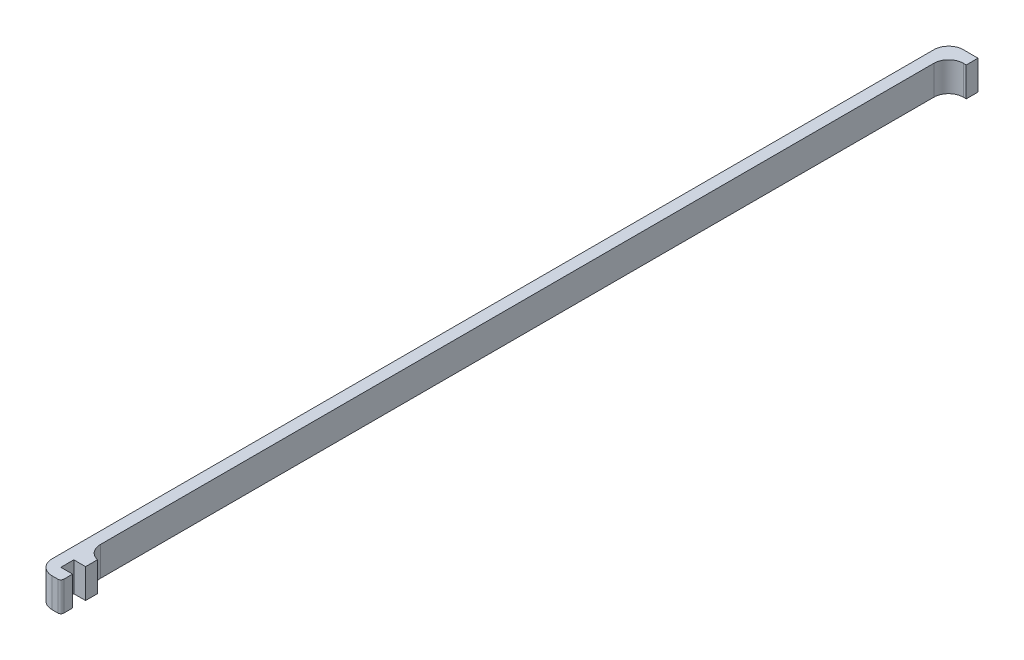
ISO-10303-21;
HEADER;
FILE_DESCRIPTION(('STEP AP214'),'2;1');
FILE_NAME('part.step','',(''),(''),'','','');
FILE_SCHEMA(('AUTOMOTIVE_DESIGN { 1 0 10303 214 1 1 1 1 }'));
ENDSEC;
DATA;
#1=APPLICATION_CONTEXT('core data for automotive mechanical design processes');
#2=APPLICATION_PROTOCOL_DEFINITION('international standard','automotive_design',2000,#1);
#3=PRODUCT_CONTEXT('',#1,'mechanical');
#4=PRODUCT('Part','Part','',(#3));
#5=PRODUCT_RELATED_PRODUCT_CATEGORY('part','',(#4));
#6=PRODUCT_DEFINITION_FORMATION('','',#4);
#7=PRODUCT_DEFINITION_CONTEXT('part definition',#1,'design');
#8=PRODUCT_DEFINITION('design','',#6,#7);
#9=PRODUCT_DEFINITION_SHAPE('','',#8);
#10=(LENGTH_UNIT() NAMED_UNIT(*) SI_UNIT(.MILLI.,.METRE.));
#11=(NAMED_UNIT(*) PLANE_ANGLE_UNIT() SI_UNIT($,.RADIAN.));
#12=(NAMED_UNIT(*) SI_UNIT($,.STERADIAN.) SOLID_ANGLE_UNIT());
#13=UNCERTAINTY_MEASURE_WITH_UNIT(LENGTH_MEASURE(1.E-05),#10,'distance_accuracy_value','');
#14=(GEOMETRIC_REPRESENTATION_CONTEXT(3) GLOBAL_UNCERTAINTY_ASSIGNED_CONTEXT((#13)) GLOBAL_UNIT_ASSIGNED_CONTEXT((#10,
#11,#12)) REPRESENTATION_CONTEXT('',''));
#15=CARTESIAN_POINT('',(0.,0.,0.));
#16=DIRECTION('',(0.,0.,1.));
#17=DIRECTION('',(1.,0.,0.));
#18=AXIS2_PLACEMENT_3D('',#15,#16,#17);
#19=CARTESIAN_POINT('',(-19.5,2.,-77.5));
#20=DIRECTION('',(0.,0.,1.));
#21=DIRECTION('',(1.,0.,0.));
#22=AXIS2_PLACEMENT_3D('',#19,#20,#21);
#23=PLANE('',#22);
#24=DIRECTION('',(0.,-1.,0.));
#25=VECTOR('',#24,1.);
#26=CARTESIAN_POINT('',(-14.5,2.,-77.5));
#27=LINE('',#26,#25);
#28=CARTESIAN_POINT('',(-14.5,30.,-77.5));
#29=VERTEX_POINT('',#28);
#30=CARTESIAN_POINT('',(-14.5,25.,-77.5));
#31=VERTEX_POINT('',#30);
#32=EDGE_CURVE('E267',#29,#31,#27,.T.);
#33=ORIENTED_EDGE('',*,*,#32,.T.);
#34=DIRECTION('',(-1.,0.,0.));
#35=VECTOR('',#34,1.);
#36=CARTESIAN_POINT('',(-14.5,25.,-77.5));
#37=LINE('',#36,#35);
#38=CARTESIAN_POINT('',(-17.,25.,-77.5));
#39=VERTEX_POINT('',#38);
#40=EDGE_CURVE('E98',#31,#39,#37,.T.);
#41=ORIENTED_EDGE('',*,*,#40,.T.);
#42=DIRECTION('',(0.,-1.,0.));
#43=VECTOR('',#42,1.);
#44=CARTESIAN_POINT('',(-17.,2.,-77.5));
#45=LINE('',#44,#43);
#46=CARTESIAN_POINT('',(-17.,30.,-77.5));
#47=VERTEX_POINT('',#46);
#48=EDGE_CURVE('E227',#39,#47,#45,.F.);
#49=ORIENTED_EDGE('',*,*,#48,.T.);
#50=DIRECTION('',(1.,0.,0.));
#51=VECTOR('',#50,1.);
#52=CARTESIAN_POINT('',(-19.5,30.,-77.5));
#53=LINE('',#52,#51);
#54=EDGE_CURVE('E253',#47,#29,#53,.T.);
#55=ORIENTED_EDGE('',*,*,#54,.T.);
#56=EDGE_LOOP('',(#33,#41,#49,#55));
#57=FACE_BOUND('',#56,.T.);
#58=ADVANCED_FACE('F83',(#57),#23,.F.);
#59=CARTESIAN_POINT('',(-17.5,42.8284271247462,75.5));
#60=DIRECTION('',(0.,0.,1.));
#61=DIRECTION('',(1.,0.,0.));
#62=AXIS2_PLACEMENT_3D('',#59,#60,#61);
#63=PLANE('',#62);
#64=DIRECTION('',(0.,-1.,0.));
#65=VECTOR('',#64,1.);
#66=CARTESIAN_POINT('',(-15.5,42.8284271247462,75.5));
#67=LINE('',#66,#65);
#68=CARTESIAN_POINT('',(-15.5,30.,75.5));
#69=VERTEX_POINT('',#68);
#70=CARTESIAN_POINT('',(-15.5,25.,75.5));
#71=VERTEX_POINT('',#70);
#72=EDGE_CURVE('E277',#69,#71,#67,.T.);
#73=ORIENTED_EDGE('',*,*,#72,.T.);
#74=DIRECTION('',(-1.,0.,0.));
#75=VECTOR('',#74,1.);
#76=CARTESIAN_POINT('',(-17.5,25.,75.5));
#77=LINE('',#76,#75);
#78=CARTESIAN_POINT('',(-17.5,25.,75.5));
#79=VERTEX_POINT('',#78);
#80=EDGE_CURVE('E325',#71,#79,#77,.T.);
#81=ORIENTED_EDGE('',*,*,#80,.T.);
#82=DIRECTION('',(0.,-1.,0.));
#83=VECTOR('',#82,1.);
#84=CARTESIAN_POINT('',(-17.5,42.8284271247462,75.5));
#85=LINE('',#84,#83);
#86=CARTESIAN_POINT('',(-17.5,30.,75.5));
#87=VERTEX_POINT('',#86);
#88=EDGE_CURVE('E276',#87,#79,#85,.T.);
#89=ORIENTED_EDGE('',*,*,#88,.F.);
#90=DIRECTION('',(1.,0.,0.));
#91=VECTOR('',#90,1.);
#92=CARTESIAN_POINT('',(-17.5,30.,75.5));
#93=LINE('',#92,#91);
#94=EDGE_CURVE('E261',#87,#69,#93,.T.);
#95=ORIENTED_EDGE('',*,*,#94,.T.);
#96=EDGE_LOOP('',(#73,#81,#89,#95));
#97=FACE_BOUND('',#96,.T.);
#98=ADVANCED_FACE('F318',(#97),#63,.F.);
#99=CARTESIAN_POINT('',(-19.5,2.,77.5));
#100=DIRECTION('',(0.,0.,-1.));
#101=DIRECTION('',(-1.,0.,0.));
#102=AXIS2_PLACEMENT_3D('',#99,#100,#101);
#103=PLANE('',#102);
#104=DIRECTION('',(0.,-1.,0.));
#105=VECTOR('',#104,1.);
#106=CARTESIAN_POINT('',(-17.,2.,77.5));
#107=LINE('',#106,#105);
#108=CARTESIAN_POINT('',(-17.,30.,77.5));
#109=VERTEX_POINT('',#108);
#110=CARTESIAN_POINT('',(-17.,25.,77.5));
#111=VERTEX_POINT('',#110);
#112=EDGE_CURVE('E280',#109,#111,#107,.T.);
#113=ORIENTED_EDGE('',*,*,#112,.T.);
#114=DIRECTION('',(-1.,0.,0.));
#115=VECTOR('',#114,1.);
#116=CARTESIAN_POINT('',(-14.5,25.,77.5));
#117=LINE('',#116,#115);
#118=CARTESIAN_POINT('',(-16.,25.,77.5));
#119=VERTEX_POINT('',#118);
#120=EDGE_CURVE('E202',#119,#111,#117,.T.);
#121=ORIENTED_EDGE('',*,*,#120,.F.);
#122=DIRECTION('',(0.,-1.,0.));
#123=VECTOR('',#122,1.);
#124=CARTESIAN_POINT('',(-16.,2.,77.5));
#125=LINE('',#124,#123);
#126=CARTESIAN_POINT('',(-16.,30.,77.5));
#127=VERTEX_POINT('',#126);
#128=EDGE_CURVE('E91',#119,#127,#125,.F.);
#129=ORIENTED_EDGE('',*,*,#128,.T.);
#130=DIRECTION('',(1.,0.,0.));
#131=VECTOR('',#130,1.);
#132=CARTESIAN_POINT('',(-19.5,30.,77.5));
#133=LINE('',#132,#131);
#134=EDGE_CURVE('E245',#109,#127,#133,.T.);
#135=ORIENTED_EDGE('',*,*,#134,.F.);
#136=EDGE_LOOP('',(#113,#121,#129,#135));
#137=FACE_BOUND('',#136,.T.);
#138=ADVANCED_FACE('F244',(#137),#103,.F.);
#139=CARTESIAN_POINT('',(-17.5,42.8284271247462,73.3));
#140=DIRECTION('',(0.,0.,-1.));
#141=DIRECTION('',(-1.,0.,0.));
#142=AXIS2_PLACEMENT_3D('',#139,#140,#141);
#143=PLANE('',#142);
#144=DIRECTION('',(0.,-1.,0.));
#145=VECTOR('',#144,1.);
#146=CARTESIAN_POINT('',(-17.5,42.8284271247462,73.3));
#147=LINE('',#146,#145);
#148=CARTESIAN_POINT('',(-17.5,30.,73.3));
#149=VERTEX_POINT('',#148);
#150=CARTESIAN_POINT('',(-17.5,25.,73.3));
#151=VERTEX_POINT('',#150);
#152=EDGE_CURVE('E270',#149,#151,#147,.T.);
#153=ORIENTED_EDGE('',*,*,#152,.T.);
#154=DIRECTION('',(1.,0.,0.));
#155=VECTOR('',#154,1.);
#156=CARTESIAN_POINT('',(-17.5,25.,73.3));
#157=LINE('',#156,#155);
#158=CARTESIAN_POINT('',(-15.5,25.,73.3));
#159=VERTEX_POINT('',#158);
#160=EDGE_CURVE('E334',#151,#159,#157,.T.);
#161=ORIENTED_EDGE('',*,*,#160,.T.);
#162=DIRECTION('',(0.,-1.,0.));
#163=VECTOR('',#162,1.);
#164=CARTESIAN_POINT('',(-15.5,42.8284271247462,73.3));
#165=LINE('',#164,#163);
#166=CARTESIAN_POINT('',(-15.5,30.,73.3));
#167=VERTEX_POINT('',#166);
#168=EDGE_CURVE('E273',#167,#159,#165,.T.);
#169=ORIENTED_EDGE('',*,*,#168,.F.);
#170=DIRECTION('',(-1.,0.,0.));
#171=VECTOR('',#170,1.);
#172=CARTESIAN_POINT('',(-17.5,30.,73.3));
#173=LINE('',#172,#171);
#174=EDGE_CURVE('E310',#167,#149,#173,.T.);
#175=ORIENTED_EDGE('',*,*,#174,.T.);
#176=EDGE_LOOP('',(#153,#161,#169,#175));
#177=FACE_BOUND('',#176,.T.);
#178=ADVANCED_FACE('F391',(#177),#143,.F.);
#179=CARTESIAN_POINT('',(0.,40.,-75.5));
#180=DIRECTION('',(0.,0.,-1.));
#181=DIRECTION('',(-1.,0.,0.));
#182=AXIS2_PLACEMENT_3D('',#179,#180,#181);
#183=PLANE('',#182);
#184=DIRECTION('',(0.,-1.,0.));
#185=VECTOR('',#184,1.);
#186=CARTESIAN_POINT('',(-15.,40.,-75.5));
#187=LINE('',#186,#185);
#188=CARTESIAN_POINT('',(-15.,30.,-75.5));
#189=VERTEX_POINT('',#188);
#190=CARTESIAN_POINT('',(-15.,25.,-75.5));
#191=VERTEX_POINT('',#190);
#192=EDGE_CURVE('E233',#189,#191,#187,.T.);
#193=ORIENTED_EDGE('',*,*,#192,.T.);
#194=DIRECTION('',(1.,0.,0.));
#195=VECTOR('',#194,1.);
#196=CARTESIAN_POINT('',(0.,25.,-75.5));
#197=LINE('',#196,#195);
#198=CARTESIAN_POINT('',(-14.5,25.,-75.5));
#199=VERTEX_POINT('',#198);
#200=EDGE_CURVE('E208',#191,#199,#197,.T.);
#201=ORIENTED_EDGE('',*,*,#200,.T.);
#202=DIRECTION('',(0.,1.,0.));
#203=VECTOR('',#202,1.);
#204=CARTESIAN_POINT('',(-14.5,40.,-75.5));
#205=LINE('',#204,#203);
#206=CARTESIAN_POINT('',(-14.5,30.,-75.5));
#207=VERTEX_POINT('',#206);
#208=EDGE_CURVE('E106',#199,#207,#205,.T.);
#209=ORIENTED_EDGE('',*,*,#208,.T.);
#210=DIRECTION('',(-1.,0.,0.));
#211=VECTOR('',#210,1.);
#212=CARTESIAN_POINT('',(0.,30.,-75.5));
#213=LINE('',#212,#211);
#214=EDGE_CURVE('E290',#207,#189,#213,.T.);
#215=ORIENTED_EDGE('',*,*,#214,.T.);
#216=EDGE_LOOP('',(#193,#201,#209,#215));
#217=FACE_BOUND('',#216,.T.);
#218=ADVANCED_FACE('F347',(#217),#183,.F.);
#219=CARTESIAN_POINT('',(-15.,40.,-73.));
#220=DIRECTION('',(0.,-1.,0.));
#221=DIRECTION('',(0.,0.,-1.));
#222=AXIS2_PLACEMENT_3D('',#219,#220,#221);
#223=CYLINDRICAL_SURFACE('',#222,2.5);
#224=DIRECTION('',(0.,-1.,0.));
#225=VECTOR('',#224,1.);
#226=CARTESIAN_POINT('',(-17.5,40.,-73.));
#227=LINE('',#226,#225);
#228=CARTESIAN_POINT('',(-17.5,25.,-73.));
#229=VERTEX_POINT('',#228);
#230=CARTESIAN_POINT('',(-17.5,30.,-73.));
#231=VERTEX_POINT('',#230);
#232=EDGE_CURVE('E223',#229,#231,#227,.F.);
#233=ORIENTED_EDGE('',*,*,#232,.F.);
#234=CARTESIAN_POINT('',(-15.,25.,-73.));
#235=DIRECTION('',(0.,1.,0.));
#236=DIRECTION('',(0.,0.,1.));
#237=AXIS2_PLACEMENT_3D('',#234,#235,#236);
#238=CIRCLE('',#237,2.5);
#239=EDGE_CURVE('E345',#229,#191,#238,.F.);
#240=ORIENTED_EDGE('',*,*,#239,.T.);
#241=ORIENTED_EDGE('',*,*,#192,.F.);
#242=CARTESIAN_POINT('',(-15.,30.,-73.));
#243=DIRECTION('',(0.,-1.,0.));
#244=DIRECTION('',(0.,0.,-1.));
#245=AXIS2_PLACEMENT_3D('',#242,#243,#244);
#246=CIRCLE('',#245,2.5);
#247=EDGE_CURVE('E298',#189,#231,#246,.F.);
#248=ORIENTED_EDGE('',*,*,#247,.T.);
#249=EDGE_LOOP('',(#233,#240,#241,#248));
#250=FACE_BOUND('',#249,.T.);
#251=ADVANCED_FACE('F379',(#250),#223,.F.);
#252=CARTESIAN_POINT('',(-17.5,40.,0.));
#253=DIRECTION('',(1.,0.,0.));
#254=DIRECTION('',(0.,0.,-1.));
#255=AXIS2_PLACEMENT_3D('',#252,#253,#254);
#256=PLANE('',#255);
#257=DIRECTION('',(0.,0.,1.));
#258=VECTOR('',#257,1.);
#259=CARTESIAN_POINT('',(-17.5,25.,0.));
#260=LINE('',#259,#258);
#261=EDGE_CURVE('E328',#151,#79,#260,.T.);
#262=ORIENTED_EDGE('',*,*,#261,.F.);
#263=ORIENTED_EDGE('',*,*,#152,.F.);
#264=DIRECTION('',(0.,0.,-1.));
#265=VECTOR('',#264,1.);
#266=CARTESIAN_POINT('',(-17.5,30.,0.));
#267=LINE('',#266,#265);
#268=EDGE_CURVE('E313',#87,#149,#267,.T.);
#269=ORIENTED_EDGE('',*,*,#268,.F.);
#270=ORIENTED_EDGE('',*,*,#88,.T.);
#271=EDGE_LOOP('',(#262,#263,#269,#270));
#272=FACE_BOUND('',#271,.T.);
#273=ADVANCED_FACE('F381',(#272),#256,.T.);
#274=CARTESIAN_POINT('',(-15.5,42.8284271247462,77.5));
#275=DIRECTION('',(-1.,0.,0.));
#276=DIRECTION('',(0.,0.,1.));
#277=AXIS2_PLACEMENT_3D('',#274,#275,#276);
#278=PLANE('',#277);
#279=ORIENTED_EDGE('',*,*,#168,.T.);
#280=DIRECTION('',(0.,0.,-1.));
#281=VECTOR('',#280,1.);
#282=CARTESIAN_POINT('',(-15.5,25.,77.5));
#283=LINE('',#282,#281);
#284=CARTESIAN_POINT('',(-15.5,25.,71.2494897427832));
#285=VERTEX_POINT('',#284);
#286=EDGE_CURVE('E337',#159,#285,#283,.T.);
#287=ORIENTED_EDGE('',*,*,#286,.T.);
#288=DIRECTION('',(0.,-1.,0.));
#289=VECTOR('',#288,1.);
#290=CARTESIAN_POINT('',(-15.5,4.,71.2494897427832));
#291=LINE('',#290,#289);
#292=CARTESIAN_POINT('',(-15.5,30.,71.2494897427832));
#293=VERTEX_POINT('',#292);
#294=EDGE_CURVE('E236',#285,#293,#291,.F.);
#295=ORIENTED_EDGE('',*,*,#294,.T.);
#296=DIRECTION('',(0.,0.,1.));
#297=VECTOR('',#296,1.);
#298=CARTESIAN_POINT('',(-15.5,30.,77.5));
#299=LINE('',#298,#297);
#300=EDGE_CURVE('E307',#293,#167,#299,.T.);
#301=ORIENTED_EDGE('',*,*,#300,.T.);
#302=EDGE_LOOP('',(#279,#287,#295,#301));
#303=FACE_BOUND('',#302,.T.);
#304=ADVANCED_FACE('F387',(#303),#278,.F.);
#305=DIRECTION('',(0.,-1.,0.));
#306=VECTOR('',#305,1.);
#307=CARTESIAN_POINT('',(-15.5,42.8284271247462,77.));
#308=LINE('',#307,#306);
#309=CARTESIAN_POINT('',(-15.5,30.,77.));
#310=VERTEX_POINT('',#309);
#311=CARTESIAN_POINT('',(-15.5,25.,77.));
#312=VERTEX_POINT('',#311);
#313=EDGE_CURVE('E238',#310,#312,#308,.T.);
#314=ORIENTED_EDGE('',*,*,#313,.T.);
#315=DIRECTION('',(0.,0.,-1.));
#316=VECTOR('',#315,1.);
#317=CARTESIAN_POINT('',(-15.5,25.,77.5));
#318=LINE('',#317,#316);
#319=EDGE_CURVE('E324',#312,#71,#318,.T.);
#320=ORIENTED_EDGE('',*,*,#319,.T.);
#321=ORIENTED_EDGE('',*,*,#72,.F.);
#322=DIRECTION('',(0.,0.,1.));
#323=VECTOR('',#322,1.);
#324=CARTESIAN_POINT('',(-15.5,30.,77.5));
#325=LINE('',#324,#323);
#326=EDGE_CURVE('E257',#69,#310,#325,.T.);
#327=ORIENTED_EDGE('',*,*,#326,.T.);
#328=EDGE_LOOP('',(#314,#320,#321,#327));
#329=FACE_BOUND('',#328,.T.);
#330=ADVANCED_FACE('F323',(#329),#278,.F.);
#331=DIRECTION('',(0.,0.,1.));
#332=VECTOR('',#331,1.);
#333=CARTESIAN_POINT('',(-17.5,25.,0.));
#334=LINE('',#333,#332);
#335=CARTESIAN_POINT('',(-17.5,25.,68.8));
#336=VERTEX_POINT('',#335);
#337=EDGE_CURVE('E343',#229,#336,#334,.T.);
#338=ORIENTED_EDGE('',*,*,#337,.F.);
#339=ORIENTED_EDGE('',*,*,#232,.T.);
#340=DIRECTION('',(0.,0.,-1.));
#341=VECTOR('',#340,1.);
#342=CARTESIAN_POINT('',(-17.5,30.,0.));
#343=LINE('',#342,#341);
#344=CARTESIAN_POINT('',(-17.5,30.,68.8));
#345=VERTEX_POINT('',#344);
#346=EDGE_CURVE('E301',#345,#231,#343,.T.);
#347=ORIENTED_EDGE('',*,*,#346,.F.);
#348=DIRECTION('',(0.,-1.,0.));
#349=VECTOR('',#348,1.);
#350=CARTESIAN_POINT('',(-17.5,40.,68.8));
#351=LINE('',#350,#349);
#352=EDGE_CURVE('E225',#345,#336,#351,.T.);
#353=ORIENTED_EDGE('',*,*,#352,.T.);
#354=EDGE_LOOP('',(#338,#339,#347,#353));
#355=FACE_BOUND('',#354,.T.);
#356=ADVANCED_FACE('F390',(#355),#256,.T.);
#357=CARTESIAN_POINT('',(-19.5,2.,-77.5));
#358=DIRECTION('',(1.,0.,0.));
#359=DIRECTION('',(0.,0.,-1.));
#360=AXIS2_PLACEMENT_3D('',#357,#358,#359);
#361=PLANE('',#360);
#362=DIRECTION('',(0.,-1.,0.));
#363=VECTOR('',#362,1.);
#364=CARTESIAN_POINT('',(-19.5,2.,-75.));
#365=LINE('',#364,#363);
#366=CARTESIAN_POINT('',(-19.5,30.,-75.));
#367=VERTEX_POINT('',#366);
#368=CARTESIAN_POINT('',(-19.5,25.,-75.));
#369=VERTEX_POINT('',#368);
#370=EDGE_CURVE('E217',#367,#369,#365,.T.);
#371=ORIENTED_EDGE('',*,*,#370,.T.);
#372=DIRECTION('',(0.,0.,-1.));
#373=VECTOR('',#372,1.);
#374=CARTESIAN_POINT('',(-19.5,25.,-77.5));
#375=LINE('',#374,#373);
#376=CARTESIAN_POINT('',(-19.5,25.,75.));
#377=VERTEX_POINT('',#376);
#378=EDGE_CURVE('E199',#377,#369,#375,.T.);
#379=ORIENTED_EDGE('',*,*,#378,.F.);
#380=DIRECTION('',(0.,-1.,0.));
#381=VECTOR('',#380,1.);
#382=CARTESIAN_POINT('',(-19.5,2.,75.));
#383=LINE('',#382,#381);
#384=CARTESIAN_POINT('',(-19.5,30.,75.));
#385=VERTEX_POINT('',#384);
#386=EDGE_CURVE('E214',#377,#385,#383,.F.);
#387=ORIENTED_EDGE('',*,*,#386,.T.);
#388=DIRECTION('',(0.,0.,-1.));
#389=VECTOR('',#388,1.);
#390=CARTESIAN_POINT('',(-19.5,30.,0.));
#391=LINE('',#390,#389);
#392=EDGE_CURVE('E254',#385,#367,#391,.T.);
#393=ORIENTED_EDGE('',*,*,#392,.T.);
#394=EDGE_LOOP('',(#371,#379,#387,#393));
#395=FACE_BOUND('',#394,.T.);
#396=ADVANCED_FACE('F212',(#395),#361,.F.);
#397=CARTESIAN_POINT('',(-17.,2.,-75.));
#398=DIRECTION('',(0.,-1.,0.));
#399=DIRECTION('',(0.,0.,-1.));
#400=AXIS2_PLACEMENT_3D('',#397,#398,#399);
#401=CYLINDRICAL_SURFACE('',#400,2.5);
#402=CARTESIAN_POINT('',(-17.,25.,-75.));
#403=DIRECTION('',(0.,1.,0.));
#404=DIRECTION('',(0.,0.,1.));
#405=AXIS2_PLACEMENT_3D('',#402,#403,#404);
#406=CIRCLE('',#405,2.5);
#407=EDGE_CURVE('E207',#369,#39,#406,.F.);
#408=ORIENTED_EDGE('',*,*,#407,.F.);
#409=ORIENTED_EDGE('',*,*,#370,.F.);
#410=CARTESIAN_POINT('',(-17.,30.,-75.));
#411=DIRECTION('',(0.,-1.,0.));
#412=DIRECTION('',(0.,0.,-1.));
#413=AXIS2_PLACEMENT_3D('',#410,#411,#412);
#414=CIRCLE('',#413,2.5);
#415=EDGE_CURVE('E259',#47,#367,#414,.F.);
#416=ORIENTED_EDGE('',*,*,#415,.F.);
#417=ORIENTED_EDGE('',*,*,#48,.F.);
#418=EDGE_LOOP('',(#408,#409,#416,#417));
#419=FACE_BOUND('',#418,.T.);
#420=ADVANCED_FACE('F292',(#419),#401,.T.);
#421=CARTESIAN_POINT('',(-17.,2.,75.));
#422=DIRECTION('',(0.,-1.,0.));
#423=DIRECTION('',(0.,0.,-1.));
#424=AXIS2_PLACEMENT_3D('',#421,#422,#423);
#425=CYLINDRICAL_SURFACE('',#424,2.5);
#426=CARTESIAN_POINT('',(-17.,25.,75.));
#427=DIRECTION('',(0.,1.,0.));
#428=DIRECTION('',(0.,0.,1.));
#429=AXIS2_PLACEMENT_3D('',#426,#427,#428);
#430=CIRCLE('',#429,2.5);
#431=EDGE_CURVE('E196',#111,#377,#430,.F.);
#432=ORIENTED_EDGE('',*,*,#431,.F.);
#433=ORIENTED_EDGE('',*,*,#112,.F.);
#434=CARTESIAN_POINT('',(-17.,30.,75.));
#435=DIRECTION('',(0.,-1.,0.));
#436=DIRECTION('',(0.,0.,-1.));
#437=AXIS2_PLACEMENT_3D('',#434,#435,#436);
#438=CIRCLE('',#437,2.5);
#439=EDGE_CURVE('E222',#385,#109,#438,.F.);
#440=ORIENTED_EDGE('',*,*,#439,.F.);
#441=ORIENTED_EDGE('',*,*,#386,.F.);
#442=EDGE_LOOP('',(#432,#433,#440,#441));
#443=FACE_BOUND('',#442,.T.);
#444=ADVANCED_FACE('F221',(#443),#425,.T.);
#445=CARTESIAN_POINT('',(-15.,40.,68.8));
#446=DIRECTION('',(0.,-1.,0.));
#447=DIRECTION('',(0.,0.,-1.));
#448=AXIS2_PLACEMENT_3D('',#445,#446,#447);
#449=CYLINDRICAL_SURFACE('',#448,2.5);
#450=ORIENTED_EDGE('',*,*,#294,.F.);
#451=CARTESIAN_POINT('',(-15.,25.,68.8));
#452=DIRECTION('',(0.,1.,0.));
#453=DIRECTION('',(0.,0.,1.));
#454=AXIS2_PLACEMENT_3D('',#451,#452,#453);
#455=CIRCLE('',#454,2.5);
#456=EDGE_CURVE('E340',#285,#336,#455,.F.);
#457=ORIENTED_EDGE('',*,*,#456,.T.);
#458=ORIENTED_EDGE('',*,*,#352,.F.);
#459=CARTESIAN_POINT('',(-15.,30.,68.8));
#460=DIRECTION('',(0.,-1.,0.));
#461=DIRECTION('',(0.,0.,-1.));
#462=AXIS2_PLACEMENT_3D('',#459,#460,#461);
#463=CIRCLE('',#462,2.5);
#464=EDGE_CURVE('E304',#345,#293,#463,.F.);
#465=ORIENTED_EDGE('',*,*,#464,.T.);
#466=EDGE_LOOP('',(#450,#457,#458,#465));
#467=FACE_BOUND('',#466,.T.);
#468=ADVANCED_FACE('F361',(#467),#449,.F.);
#469=CARTESIAN_POINT('',(-16.,42.8284271247462,77.));
#470=DIRECTION('',(0.,-1.,0.));
#471=DIRECTION('',(0.,0.,-1.));
#472=AXIS2_PLACEMENT_3D('',#469,#470,#471);
#473=CYLINDRICAL_SURFACE('',#472,0.5);
#474=CARTESIAN_POINT('',(-16.,25.,77.));
#475=DIRECTION('',(0.,1.,0.));
#476=DIRECTION('',(0.,0.,1.));
#477=AXIS2_PLACEMENT_3D('',#474,#475,#476);
#478=CIRCLE('',#477,0.5);
#479=EDGE_CURVE('E326',#312,#119,#478,.F.);
#480=ORIENTED_EDGE('',*,*,#479,.F.);
#481=ORIENTED_EDGE('',*,*,#313,.F.);
#482=CARTESIAN_POINT('',(-16.,30.,77.));
#483=DIRECTION('',(0.,-1.,0.));
#484=DIRECTION('',(0.,0.,-1.));
#485=AXIS2_PLACEMENT_3D('',#482,#483,#484);
#486=CIRCLE('',#485,0.5);
#487=EDGE_CURVE('E251',#127,#310,#486,.F.);
#488=ORIENTED_EDGE('',*,*,#487,.F.);
#489=ORIENTED_EDGE('',*,*,#128,.F.);
#490=EDGE_LOOP('',(#480,#481,#488,#489));
#491=FACE_BOUND('',#490,.T.);
#492=ADVANCED_FACE('F85',(#491),#473,.T.);
#493=CARTESIAN_POINT('',(-14.5,9.,-77.5353460179952));
#494=DIRECTION('',(-1.,0.,0.));
#495=DIRECTION('',(0.,0.,1.));
#496=AXIS2_PLACEMENT_3D('',#493,#494,#495);
#497=PLANE('',#496);
#498=ORIENTED_EDGE('',*,*,#208,.F.);
#499=DIRECTION('',(0.,0.,-1.));
#500=VECTOR('',#499,1.);
#501=CARTESIAN_POINT('',(-14.5,25.,-77.5));
#502=LINE('',#501,#500);
#503=EDGE_CURVE('E218',#199,#31,#502,.T.);
#504=ORIENTED_EDGE('',*,*,#503,.T.);
#505=ORIENTED_EDGE('',*,*,#32,.F.);
#506=DIRECTION('',(0.,0.,1.));
#507=VECTOR('',#506,1.);
#508=CARTESIAN_POINT('',(-14.5,30.,-77.5353460179952));
#509=LINE('',#508,#507);
#510=EDGE_CURVE('E12',#29,#207,#509,.T.);
#511=ORIENTED_EDGE('',*,*,#510,.T.);
#512=EDGE_LOOP('',(#498,#504,#505,#511));
#513=FACE_BOUND('',#512,.T.);
#514=ADVANCED_FACE('F350',(#513),#497,.F.);
#515=CARTESIAN_POINT('',(-19.5,30.,0.));
#516=DIRECTION('',(0.,-1.,0.));
#517=DIRECTION('',(0.,0.,-1.));
#518=AXIS2_PLACEMENT_3D('',#515,#516,#517);
#519=PLANE('',#518);
#520=ORIENTED_EDGE('',*,*,#415,.T.);
#521=ORIENTED_EDGE('',*,*,#392,.F.);
#522=ORIENTED_EDGE('',*,*,#439,.T.);
#523=ORIENTED_EDGE('',*,*,#134,.T.);
#524=ORIENTED_EDGE('',*,*,#487,.T.);
#525=ORIENTED_EDGE('',*,*,#326,.F.);
#526=ORIENTED_EDGE('',*,*,#94,.F.);
#527=ORIENTED_EDGE('',*,*,#268,.T.);
#528=ORIENTED_EDGE('',*,*,#174,.F.);
#529=ORIENTED_EDGE('',*,*,#300,.F.);
#530=ORIENTED_EDGE('',*,*,#464,.F.);
#531=ORIENTED_EDGE('',*,*,#346,.T.);
#532=ORIENTED_EDGE('',*,*,#247,.F.);
#533=ORIENTED_EDGE('',*,*,#214,.F.);
#534=ORIENTED_EDGE('',*,*,#510,.F.);
#535=ORIENTED_EDGE('',*,*,#54,.F.);
#536=EDGE_LOOP('',(#520,#521,#522,#523,#524,#525,#526,#527,#528,#529,#530,#531,#532,#533,#534,#535));
#537=FACE_BOUND('',#536,.T.);
#538=ADVANCED_FACE('F250',(#537),#519,.F.);
#539=CARTESIAN_POINT('',(-14.5,25.,-77.5));
#540=DIRECTION('',(0.,1.,0.));
#541=DIRECTION('',(0.,0.,1.));
#542=AXIS2_PLACEMENT_3D('',#539,#540,#541);
#543=PLANE('',#542);
#544=ORIENTED_EDGE('',*,*,#407,.T.);
#545=ORIENTED_EDGE('',*,*,#40,.F.);
#546=ORIENTED_EDGE('',*,*,#503,.F.);
#547=ORIENTED_EDGE('',*,*,#200,.F.);
#548=ORIENTED_EDGE('',*,*,#239,.F.);
#549=ORIENTED_EDGE('',*,*,#337,.T.);
#550=ORIENTED_EDGE('',*,*,#456,.F.);
#551=ORIENTED_EDGE('',*,*,#286,.F.);
#552=ORIENTED_EDGE('',*,*,#160,.F.);
#553=ORIENTED_EDGE('',*,*,#261,.T.);
#554=ORIENTED_EDGE('',*,*,#80,.F.);
#555=ORIENTED_EDGE('',*,*,#319,.F.);
#556=ORIENTED_EDGE('',*,*,#479,.T.);
#557=ORIENTED_EDGE('',*,*,#120,.T.);
#558=ORIENTED_EDGE('',*,*,#431,.T.);
#559=ORIENTED_EDGE('',*,*,#378,.T.);
#560=EDGE_LOOP('',(#544,#545,#546,#547,#548,#549,#550,#551,#552,#553,#554,#555,#556,#557,#558,#559));
#561=FACE_BOUND('',#560,.T.);
#562=ADVANCED_FACE('F198',(#561),#543,.F.);
#563=CLOSED_SHELL('',(#58,#98,#138,#178,#218,#251,#273,#304,#330,#356,#396,#420,#444,#468,#492,
#514,#538,#562));
#564=MANIFOLD_SOLID_BREP('B2',#563);
#565=ADVANCED_BREP_SHAPE_REPRESENTATION('',(#18,#564),#14);
#566=SHAPE_DEFINITION_REPRESENTATION(#9,#565);
ENDSEC;
END-ISO-10303-21;
